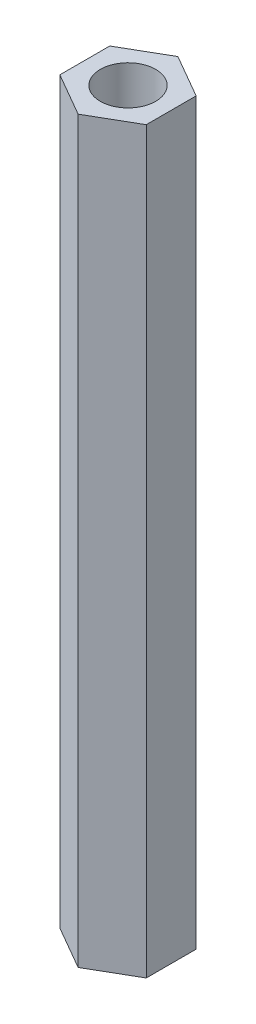
ISO-10303-21;
HEADER;
FILE_DESCRIPTION(('STEP AP214'),'2;1');
FILE_NAME('part.step','',(''),(''),'','','');
FILE_SCHEMA(('AUTOMOTIVE_DESIGN { 1 0 10303 214 1 1 1 1 }'));
ENDSEC;
DATA;
#1=APPLICATION_CONTEXT('core data for automotive mechanical design processes');
#2=APPLICATION_PROTOCOL_DEFINITION('international standard','automotive_design',2000,#1);
#3=PRODUCT_CONTEXT('',#1,'mechanical');
#4=PRODUCT('Part','Part','',(#3));
#5=PRODUCT_RELATED_PRODUCT_CATEGORY('part','',(#4));
#6=PRODUCT_DEFINITION_FORMATION('','',#4);
#7=PRODUCT_DEFINITION_CONTEXT('part definition',#1,'design');
#8=PRODUCT_DEFINITION('design','',#6,#7);
#9=PRODUCT_DEFINITION_SHAPE('','',#8);
#10=(LENGTH_UNIT() NAMED_UNIT(*) SI_UNIT(.MILLI.,.METRE.));
#11=(NAMED_UNIT(*) PLANE_ANGLE_UNIT() SI_UNIT($,.RADIAN.));
#12=(NAMED_UNIT(*) SI_UNIT($,.STERADIAN.) SOLID_ANGLE_UNIT());
#13=UNCERTAINTY_MEASURE_WITH_UNIT(LENGTH_MEASURE(1.E-05),#10,'distance_accuracy_value','');
#14=(GEOMETRIC_REPRESENTATION_CONTEXT(3) GLOBAL_UNCERTAINTY_ASSIGNED_CONTEXT((#13)) GLOBAL_UNIT_ASSIGNED_CONTEXT((#10,
#11,#12)) REPRESENTATION_CONTEXT('',''));
#15=CARTESIAN_POINT('',(0.,0.,0.));
#16=DIRECTION('',(0.,0.,1.));
#17=DIRECTION('',(1.,0.,0.));
#18=AXIS2_PLACEMENT_3D('',#15,#16,#17);
#19=CARTESIAN_POINT('',(0.,40.,0.));
#20=DIRECTION('',(0.,1.,0.));
#21=DIRECTION('',(0.,0.,1.));
#22=AXIS2_PLACEMENT_3D('',#19,#20,#21);
#23=PLANE('',#22);
#24=CARTESIAN_POINT('',(0.,40.,0.));
#25=DIRECTION('',(0.,1.,0.));
#26=DIRECTION('',(0.,0.,1.));
#27=AXIS2_PLACEMENT_3D('',#24,#25,#26);
#28=CIRCLE('',#27,1.5);
#29=CARTESIAN_POINT('',(0.,40.,1.5));
#30=VERTEX_POINT('',#29);
#31=EDGE_CURVE('E12',#30,#30,#28,.T.);
#32=ORIENTED_EDGE('',*,*,#31,.F.);
#33=EDGE_LOOP('',(#32));
#34=FACE_BOUND('',#33,.T.);
#35=DIRECTION('',(0.,0.,-1.));
#36=VECTOR('',#35,1.);
#37=CARTESIAN_POINT('',(2.33826859021798,40.,0.));
#38=LINE('',#37,#36);
#39=CARTESIAN_POINT('',(2.338268590218,40.,1.34999999999998));
#40=VERTEX_POINT('',#39);
#41=CARTESIAN_POINT('',(2.33826859021797,40.,-1.35000000000003));
#42=VERTEX_POINT('',#41);
#43=EDGE_CURVE('E112',#40,#42,#38,.T.);
#44=ORIENTED_EDGE('',*,*,#43,.T.);
#45=DIRECTION('',(-0.866025403784442,0.,-0.499999999999995));
#46=VECTOR('',#45,1.);
#47=CARTESIAN_POINT('',(1.16913429510898,40.,-2.02500000000001));
#48=LINE('',#47,#46);
#49=CARTESIAN_POINT('',(0.,40.,-2.7));
#50=VERTEX_POINT('',#49);
#51=EDGE_CURVE('E107',#42,#50,#48,.T.);
#52=ORIENTED_EDGE('',*,*,#51,.T.);
#53=DIRECTION('',(-0.866025403784438,0.,0.500000000000001));
#54=VECTOR('',#53,1.);
#55=CARTESIAN_POINT('',(-1.16913429510899,40.,-2.025));
#56=LINE('',#55,#54);
#57=CARTESIAN_POINT('',(-2.33826859021799,40.,-1.34999999999999));
#58=VERTEX_POINT('',#57);
#59=EDGE_CURVE('E147',#50,#58,#56,.T.);
#60=ORIENTED_EDGE('',*,*,#59,.T.);
#61=DIRECTION('',(0.,0.,1.));
#62=VECTOR('',#61,1.);
#63=CARTESIAN_POINT('',(-2.33826859021798,40.,0.));
#64=LINE('',#63,#62);
#65=CARTESIAN_POINT('',(-2.33826859021798,40.,1.35000000000001));
#66=VERTEX_POINT('',#65);
#67=EDGE_CURVE('E63',#58,#66,#64,.T.);
#68=ORIENTED_EDGE('',*,*,#67,.T.);
#69=DIRECTION('',(0.866025403784442,0.,0.499999999999995));
#70=VECTOR('',#69,1.);
#71=CARTESIAN_POINT('',(-1.16913429510898,40.,2.02500000000001));
#72=LINE('',#71,#70);
#73=CARTESIAN_POINT('',(0.,40.,2.7));
#74=VERTEX_POINT('',#73);
#75=EDGE_CURVE('E72',#66,#74,#72,.T.);
#76=ORIENTED_EDGE('',*,*,#75,.T.);
#77=DIRECTION('',(0.866025403784435,0.,-0.500000000000007));
#78=VECTOR('',#77,1.);
#79=CARTESIAN_POINT('',(1.16913429510901,40.,2.02499999999999));
#80=LINE('',#79,#78);
#81=EDGE_CURVE('E126',#74,#40,#80,.T.);
#82=ORIENTED_EDGE('',*,*,#81,.T.);
#83=EDGE_LOOP('',(#44,#52,#60,#68,#76,#82));
#84=FACE_BOUND('',#83,.T.);
#85=ADVANCED_FACE('F48',(#34,#84),#23,.T.);
#86=CARTESIAN_POINT('',(0.,0.,0.));
#87=DIRECTION('',(0.,1.,0.));
#88=DIRECTION('',(0.,0.,1.));
#89=AXIS2_PLACEMENT_3D('',#86,#87,#88);
#90=PLANE('',#89);
#91=CARTESIAN_POINT('',(0.,0.,0.));
#92=DIRECTION('',(0.,1.,0.));
#93=DIRECTION('',(0.,0.,1.));
#94=AXIS2_PLACEMENT_3D('',#91,#92,#93);
#95=CIRCLE('',#94,1.5);
#96=CARTESIAN_POINT('',(0.,0.,1.5));
#97=VERTEX_POINT('',#96);
#98=EDGE_CURVE('E52',#97,#97,#95,.T.);
#99=ORIENTED_EDGE('',*,*,#98,.T.);
#100=EDGE_LOOP('',(#99));
#101=FACE_BOUND('',#100,.T.);
#102=DIRECTION('',(-0.866025403784442,0.,-0.499999999999995));
#103=VECTOR('',#102,1.);
#104=CARTESIAN_POINT('',(1.16913429510898,0.,-2.02500000000001));
#105=LINE('',#104,#103);
#106=CARTESIAN_POINT('',(2.33826859021797,0.,-1.35000000000003));
#107=VERTEX_POINT('',#106);
#108=CARTESIAN_POINT('',(0.,0.,-2.7));
#109=VERTEX_POINT('',#108);
#110=EDGE_CURVE('E104',#107,#109,#105,.T.);
#111=ORIENTED_EDGE('',*,*,#110,.F.);
#112=DIRECTION('',(0.,0.,-1.));
#113=VECTOR('',#112,1.);
#114=CARTESIAN_POINT('',(2.33826859021798,0.,0.));
#115=LINE('',#114,#113);
#116=CARTESIAN_POINT('',(2.338268590218,0.,1.34999999999998));
#117=VERTEX_POINT('',#116);
#118=EDGE_CURVE('E111',#117,#107,#115,.T.);
#119=ORIENTED_EDGE('',*,*,#118,.F.);
#120=DIRECTION('',(0.866025403784435,0.,-0.500000000000007));
#121=VECTOR('',#120,1.);
#122=CARTESIAN_POINT('',(1.16913429510901,0.,2.02499999999999));
#123=LINE('',#122,#121);
#124=CARTESIAN_POINT('',(0.,0.,2.7));
#125=VERTEX_POINT('',#124);
#126=EDGE_CURVE('E132',#125,#117,#123,.T.);
#127=ORIENTED_EDGE('',*,*,#126,.F.);
#128=DIRECTION('',(0.866025403784442,0.,0.499999999999995));
#129=VECTOR('',#128,1.);
#130=CARTESIAN_POINT('',(-1.16913429510898,0.,2.02500000000001));
#131=LINE('',#130,#129);
#132=CARTESIAN_POINT('',(-2.33826859021798,0.,1.35000000000001));
#133=VERTEX_POINT('',#132);
#134=EDGE_CURVE('E137',#133,#125,#131,.T.);
#135=ORIENTED_EDGE('',*,*,#134,.F.);
#136=DIRECTION('',(0.,0.,1.));
#137=VECTOR('',#136,1.);
#138=CARTESIAN_POINT('',(-2.33826859021798,0.,0.));
#139=LINE('',#138,#137);
#140=CARTESIAN_POINT('',(-2.33826859021799,0.,-1.34999999999999));
#141=VERTEX_POINT('',#140);
#142=EDGE_CURVE('E143',#141,#133,#139,.T.);
#143=ORIENTED_EDGE('',*,*,#142,.F.);
#144=DIRECTION('',(-0.866025403784438,0.,0.500000000000001));
#145=VECTOR('',#144,1.);
#146=CARTESIAN_POINT('',(-1.16913429510899,0.,-2.025));
#147=LINE('',#146,#145);
#148=EDGE_CURVE('E121',#109,#141,#147,.T.);
#149=ORIENTED_EDGE('',*,*,#148,.F.);
#150=EDGE_LOOP('',(#111,#119,#127,#135,#143,#149));
#151=FACE_BOUND('',#150,.T.);
#152=ADVANCED_FACE('F50',(#101,#151),#90,.F.);
#153=CARTESIAN_POINT('',(0.,40.,0.));
#154=DIRECTION('',(0.,-1.,0.));
#155=DIRECTION('',(0.,0.,-1.));
#156=AXIS2_PLACEMENT_3D('',#153,#154,#155);
#157=CYLINDRICAL_SURFACE('',#156,1.5);
#158=ORIENTED_EDGE('',*,*,#31,.T.);
#159=EDGE_LOOP('',(#158));
#160=FACE_BOUND('',#159,.T.);
#161=ORIENTED_EDGE('',*,*,#98,.F.);
#162=EDGE_LOOP('',(#161));
#163=FACE_BOUND('',#162,.T.);
#164=ADVANCED_FACE('F177',(#160,#163),#157,.F.);
#165=CARTESIAN_POINT('',(-1.16913429510899,0.,-2.025));
#166=DIRECTION('',(-0.500000000000001,0.,-0.866025403784438));
#167=DIRECTION('',(-0.866025403784438,0.,0.500000000000001));
#168=AXIS2_PLACEMENT_3D('',#165,#166,#167);
#169=PLANE('',#168);
#170=ORIENTED_EDGE('',*,*,#59,.F.);
#171=DIRECTION('',(0.,1.,0.));
#172=VECTOR('',#171,1.);
#173=CARTESIAN_POINT('',(0.,0.,-2.7));
#174=LINE('',#173,#172);
#175=EDGE_CURVE('E149',#109,#50,#174,.T.);
#176=ORIENTED_EDGE('',*,*,#175,.F.);
#177=ORIENTED_EDGE('',*,*,#148,.T.);
#178=DIRECTION('',(0.,1.,0.));
#179=VECTOR('',#178,1.);
#180=CARTESIAN_POINT('',(-2.33826859021799,0.,-1.34999999999999));
#181=LINE('',#180,#179);
#182=EDGE_CURVE('E152',#141,#58,#181,.T.);
#183=ORIENTED_EDGE('',*,*,#182,.T.);
#184=EDGE_LOOP('',(#170,#176,#177,#183));
#185=FACE_BOUND('',#184,.T.);
#186=ADVANCED_FACE('F158',(#185),#169,.T.);
#187=CARTESIAN_POINT('',(-2.33826859021798,0.,0.));
#188=DIRECTION('',(-1.,0.,0.));
#189=DIRECTION('',(0.,0.,1.));
#190=AXIS2_PLACEMENT_3D('',#187,#188,#189);
#191=PLANE('',#190);
#192=ORIENTED_EDGE('',*,*,#67,.F.);
#193=ORIENTED_EDGE('',*,*,#182,.F.);
#194=ORIENTED_EDGE('',*,*,#142,.T.);
#195=DIRECTION('',(0.,1.,0.));
#196=VECTOR('',#195,1.);
#197=CARTESIAN_POINT('',(-2.33826859021798,0.,1.35000000000001));
#198=LINE('',#197,#196);
#199=EDGE_CURVE('E141',#133,#66,#198,.T.);
#200=ORIENTED_EDGE('',*,*,#199,.T.);
#201=EDGE_LOOP('',(#192,#193,#194,#200));
#202=FACE_BOUND('',#201,.T.);
#203=ADVANCED_FACE('F159',(#202),#191,.T.);
#204=CARTESIAN_POINT('',(-1.16913429510898,0.,2.02500000000001));
#205=DIRECTION('',(-0.499999999999995,0.,0.866025403784442));
#206=DIRECTION('',(0.866025403784442,0.,0.499999999999995));
#207=AXIS2_PLACEMENT_3D('',#204,#205,#206);
#208=PLANE('',#207);
#209=ORIENTED_EDGE('',*,*,#75,.F.);
#210=ORIENTED_EDGE('',*,*,#199,.F.);
#211=ORIENTED_EDGE('',*,*,#134,.T.);
#212=DIRECTION('',(0.,1.,0.));
#213=VECTOR('',#212,1.);
#214=CARTESIAN_POINT('',(0.,0.,2.7));
#215=LINE('',#214,#213);
#216=EDGE_CURVE('E135',#125,#74,#215,.T.);
#217=ORIENTED_EDGE('',*,*,#216,.T.);
#218=EDGE_LOOP('',(#209,#210,#211,#217));
#219=FACE_BOUND('',#218,.T.);
#220=ADVANCED_FACE('F161',(#219),#208,.T.);
#221=CARTESIAN_POINT('',(1.16913429510901,0.,2.02499999999999));
#222=DIRECTION('',(0.500000000000007,0.,0.866025403784434));
#223=DIRECTION('',(0.866025403784435,0.,-0.500000000000007));
#224=AXIS2_PLACEMENT_3D('',#221,#222,#223);
#225=PLANE('',#224);
#226=ORIENTED_EDGE('',*,*,#81,.F.);
#227=ORIENTED_EDGE('',*,*,#216,.F.);
#228=ORIENTED_EDGE('',*,*,#126,.T.);
#229=DIRECTION('',(0.,1.,0.));
#230=VECTOR('',#229,1.);
#231=CARTESIAN_POINT('',(2.338268590218,0.,1.34999999999998));
#232=LINE('',#231,#230);
#233=EDGE_CURVE('E125',#117,#40,#232,.T.);
#234=ORIENTED_EDGE('',*,*,#233,.T.);
#235=EDGE_LOOP('',(#226,#227,#228,#234));
#236=FACE_BOUND('',#235,.T.);
#237=ADVANCED_FACE('F163',(#236),#225,.T.);
#238=CARTESIAN_POINT('',(2.33826859021798,0.,0.));
#239=DIRECTION('',(1.,0.,0.));
#240=DIRECTION('',(0.,0.,-1.));
#241=AXIS2_PLACEMENT_3D('',#238,#239,#240);
#242=PLANE('',#241);
#243=ORIENTED_EDGE('',*,*,#43,.F.);
#244=ORIENTED_EDGE('',*,*,#233,.F.);
#245=ORIENTED_EDGE('',*,*,#118,.T.);
#246=DIRECTION('',(0.,1.,0.));
#247=VECTOR('',#246,1.);
#248=CARTESIAN_POINT('',(2.33826859021797,0.,-1.35000000000003));
#249=LINE('',#248,#247);
#250=EDGE_CURVE('E101',#107,#42,#249,.T.);
#251=ORIENTED_EDGE('',*,*,#250,.T.);
#252=EDGE_LOOP('',(#243,#244,#245,#251));
#253=FACE_BOUND('',#252,.T.);
#254=ADVANCED_FACE('F123',(#253),#242,.T.);
#255=CARTESIAN_POINT('',(1.16913429510898,0.,-2.02500000000001));
#256=DIRECTION('',(0.499999999999995,0.,-0.866025403784442));
#257=DIRECTION('',(-0.866025403784442,0.,-0.499999999999995));
#258=AXIS2_PLACEMENT_3D('',#255,#256,#257);
#259=PLANE('',#258);
#260=ORIENTED_EDGE('',*,*,#51,.F.);
#261=ORIENTED_EDGE('',*,*,#250,.F.);
#262=ORIENTED_EDGE('',*,*,#110,.T.);
#263=ORIENTED_EDGE('',*,*,#175,.T.);
#264=EDGE_LOOP('',(#260,#261,#262,#263));
#265=FACE_BOUND('',#264,.T.);
#266=ADVANCED_FACE('F103',(#265),#259,.T.);
#267=CLOSED_SHELL('',(#85,#152,#164,#186,#203,#220,#237,#254,#266));
#268=MANIFOLD_SOLID_BREP('B2',#267);
#269=ADVANCED_BREP_SHAPE_REPRESENTATION('',(#18,#268),#14);
#270=SHAPE_DEFINITION_REPRESENTATION(#9,#269);
ENDSEC;
END-ISO-10303-21;
